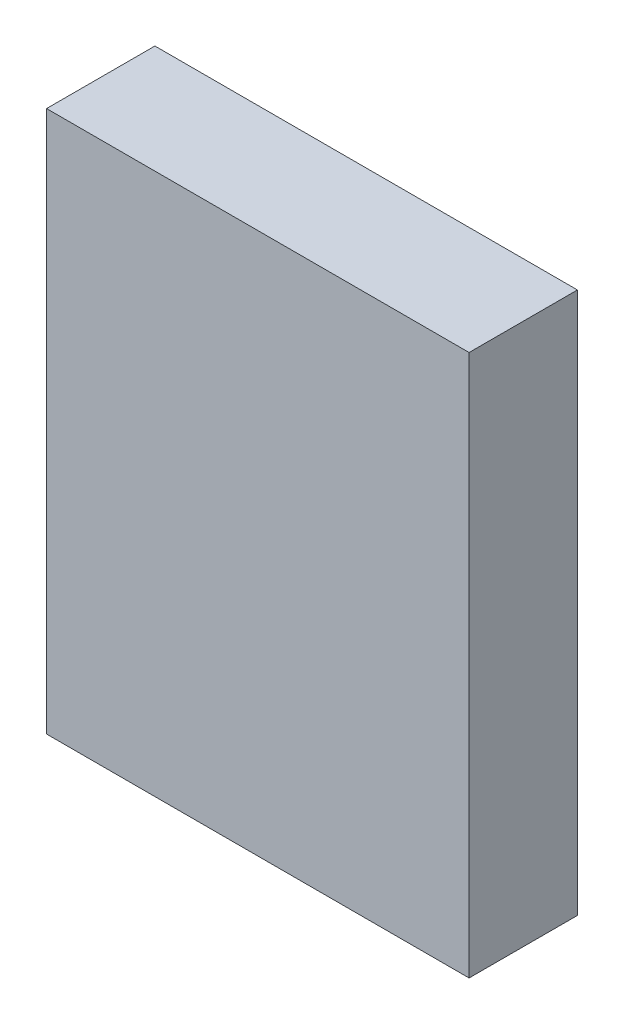
ISO-10303-21;
HEADER;
FILE_DESCRIPTION(('STEP AP214'),'2;1');
FILE_NAME('part.step','',(''),(''),'','','');
FILE_SCHEMA(('AUTOMOTIVE_DESIGN { 1 0 10303 214 1 1 1 1 }'));
ENDSEC;
DATA;
#1=APPLICATION_CONTEXT('core data for automotive mechanical design processes');
#2=APPLICATION_PROTOCOL_DEFINITION('international standard','automotive_design',2000,#1);
#3=PRODUCT_CONTEXT('',#1,'mechanical');
#4=PRODUCT('Part','Part','',(#3));
#5=PRODUCT_RELATED_PRODUCT_CATEGORY('part','',(#4));
#6=PRODUCT_DEFINITION_FORMATION('','',#4);
#7=PRODUCT_DEFINITION_CONTEXT('part definition',#1,'design');
#8=PRODUCT_DEFINITION('design','',#6,#7);
#9=PRODUCT_DEFINITION_SHAPE('','',#8);
#10=(LENGTH_UNIT() NAMED_UNIT(*) SI_UNIT(.MILLI.,.METRE.));
#11=(NAMED_UNIT(*) PLANE_ANGLE_UNIT() SI_UNIT($,.RADIAN.));
#12=(NAMED_UNIT(*) SI_UNIT($,.STERADIAN.) SOLID_ANGLE_UNIT());
#13=UNCERTAINTY_MEASURE_WITH_UNIT(LENGTH_MEASURE(1.E-05),#10,'distance_accuracy_value','');
#14=(GEOMETRIC_REPRESENTATION_CONTEXT(3) GLOBAL_UNCERTAINTY_ASSIGNED_CONTEXT((#13)) GLOBAL_UNIT_ASSIGNED_CONTEXT((#10,
#11,#12)) REPRESENTATION_CONTEXT('',''));
#15=CARTESIAN_POINT('',(0.,0.,0.));
#16=DIRECTION('',(0.,0.,1.));
#17=DIRECTION('',(1.,0.,0.));
#18=AXIS2_PLACEMENT_3D('',#15,#16,#17);
#19=CARTESIAN_POINT('',(1.95,2.5,1.));
#20=DIRECTION('',(-1.,0.,0.));
#21=DIRECTION('',(0.,-1.,0.));
#22=AXIS2_PLACEMENT_3D('',#19,#20,#21);
#23=PLANE('',#22);
#24=DIRECTION('',(0.,1.,0.));
#25=VECTOR('',#24,1.);
#26=CARTESIAN_POINT('',(1.95,2.5,0.));
#27=LINE('',#26,#25);
#28=CARTESIAN_POINT('',(1.95,-2.5,0.));
#29=VERTEX_POINT('',#28);
#30=CARTESIAN_POINT('',(1.95,2.5,0.));
#31=VERTEX_POINT('',#30);
#32=EDGE_CURVE('E95',#29,#31,#27,.T.);
#33=ORIENTED_EDGE('',*,*,#32,.T.);
#34=DIRECTION('',(0.,0.,-1.));
#35=VECTOR('',#34,1.);
#36=CARTESIAN_POINT('',(1.95,2.5,1.));
#37=LINE('',#36,#35);
#38=CARTESIAN_POINT('',(1.95,2.5,1.));
#39=VERTEX_POINT('',#38);
#40=EDGE_CURVE('E11',#39,#31,#37,.T.);
#41=ORIENTED_EDGE('',*,*,#40,.F.);
#42=DIRECTION('',(0.,1.,0.));
#43=VECTOR('',#42,1.);
#44=CARTESIAN_POINT('',(1.95,2.5,1.));
#45=LINE('',#44,#43);
#46=CARTESIAN_POINT('',(1.95,-2.5,1.));
#47=VERTEX_POINT('',#46);
#48=EDGE_CURVE('E83',#47,#39,#45,.T.);
#49=ORIENTED_EDGE('',*,*,#48,.F.);
#50=DIRECTION('',(0.,0.,-1.));
#51=VECTOR('',#50,1.);
#52=CARTESIAN_POINT('',(1.95,-2.5,1.));
#53=LINE('',#52,#51);
#54=EDGE_CURVE('E91',#47,#29,#53,.T.);
#55=ORIENTED_EDGE('',*,*,#54,.T.);
#56=EDGE_LOOP('',(#33,#41,#49,#55));
#57=FACE_BOUND('',#56,.T.);
#58=ADVANCED_FACE('F32',(#57),#23,.F.);
#59=CARTESIAN_POINT('',(-1.95,2.5,1.));
#60=DIRECTION('',(0.,-1.,0.));
#61=DIRECTION('',(0.,0.,-1.));
#62=AXIS2_PLACEMENT_3D('',#59,#60,#61);
#63=PLANE('',#62);
#64=DIRECTION('',(-1.,0.,0.));
#65=VECTOR('',#64,1.);
#66=CARTESIAN_POINT('',(-1.95,2.5,0.));
#67=LINE('',#66,#65);
#68=CARTESIAN_POINT('',(-1.95,2.5,0.));
#69=VERTEX_POINT('',#68);
#70=EDGE_CURVE('E87',#31,#69,#67,.T.);
#71=ORIENTED_EDGE('',*,*,#70,.T.);
#72=DIRECTION('',(0.,0.,-1.));
#73=VECTOR('',#72,1.);
#74=CARTESIAN_POINT('',(-1.95,2.5,1.));
#75=LINE('',#74,#73);
#76=CARTESIAN_POINT('',(-1.95,2.5,1.));
#77=VERTEX_POINT('',#76);
#78=EDGE_CURVE('E40',#77,#69,#75,.T.);
#79=ORIENTED_EDGE('',*,*,#78,.F.);
#80=DIRECTION('',(-1.,0.,0.));
#81=VECTOR('',#80,1.);
#82=CARTESIAN_POINT('',(-1.95,2.5,1.));
#83=LINE('',#82,#81);
#84=EDGE_CURVE('E78',#39,#77,#83,.T.);
#85=ORIENTED_EDGE('',*,*,#84,.F.);
#86=ORIENTED_EDGE('',*,*,#40,.T.);
#87=EDGE_LOOP('',(#71,#79,#85,#86));
#88=FACE_BOUND('',#87,.T.);
#89=ADVANCED_FACE('F86',(#88),#63,.F.);
#90=CARTESIAN_POINT('',(-1.95,2.5,1.));
#91=DIRECTION('',(1.,0.,0.));
#92=DIRECTION('',(0.,1.,0.));
#93=AXIS2_PLACEMENT_3D('',#90,#91,#92);
#94=PLANE('',#93);
#95=DIRECTION('',(0.,-1.,0.));
#96=VECTOR('',#95,1.);
#97=CARTESIAN_POINT('',(-1.95,2.5,0.));
#98=LINE('',#97,#96);
#99=CARTESIAN_POINT('',(-1.95,-2.5,0.));
#100=VERTEX_POINT('',#99);
#101=EDGE_CURVE('E65',#69,#100,#98,.T.);
#102=ORIENTED_EDGE('',*,*,#101,.T.);
#103=DIRECTION('',(0.,0.,-1.));
#104=VECTOR('',#103,1.);
#105=CARTESIAN_POINT('',(-1.95,-2.5,1.));
#106=LINE('',#105,#104);
#107=CARTESIAN_POINT('',(-1.95,-2.5,1.));
#108=VERTEX_POINT('',#107);
#109=EDGE_CURVE('E88',#108,#100,#106,.T.);
#110=ORIENTED_EDGE('',*,*,#109,.F.);
#111=DIRECTION('',(0.,-1.,0.));
#112=VECTOR('',#111,1.);
#113=CARTESIAN_POINT('',(-1.95,2.5,1.));
#114=LINE('',#113,#112);
#115=EDGE_CURVE('E81',#77,#108,#114,.T.);
#116=ORIENTED_EDGE('',*,*,#115,.F.);
#117=ORIENTED_EDGE('',*,*,#78,.T.);
#118=EDGE_LOOP('',(#102,#110,#116,#117));
#119=FACE_BOUND('',#118,.T.);
#120=ADVANCED_FACE('F89',(#119),#94,.F.);
#121=CARTESIAN_POINT('',(-1.95,-2.5,1.));
#122=DIRECTION('',(0.,1.,0.));
#123=DIRECTION('',(0.,0.,1.));
#124=AXIS2_PLACEMENT_3D('',#121,#122,#123);
#125=PLANE('',#124);
#126=DIRECTION('',(1.,0.,0.));
#127=VECTOR('',#126,1.);
#128=CARTESIAN_POINT('',(-1.95,-2.5,0.));
#129=LINE('',#128,#127);
#130=EDGE_CURVE('E71',#100,#29,#129,.T.);
#131=ORIENTED_EDGE('',*,*,#130,.T.);
#132=ORIENTED_EDGE('',*,*,#54,.F.);
#133=DIRECTION('',(1.,0.,0.));
#134=VECTOR('',#133,1.);
#135=CARTESIAN_POINT('',(-1.95,-2.5,1.));
#136=LINE('',#135,#134);
#137=EDGE_CURVE('E48',#108,#47,#136,.T.);
#138=ORIENTED_EDGE('',*,*,#137,.F.);
#139=ORIENTED_EDGE('',*,*,#109,.T.);
#140=EDGE_LOOP('',(#131,#132,#138,#139));
#141=FACE_BOUND('',#140,.T.);
#142=ADVANCED_FACE('F102',(#141),#125,.F.);
#143=CARTESIAN_POINT('',(0.,0.,1.));
#144=DIRECTION('',(0.,0.,1.));
#145=DIRECTION('',(1.,0.,0.));
#146=AXIS2_PLACEMENT_3D('',#143,#144,#145);
#147=PLANE('',#146);
#148=ORIENTED_EDGE('',*,*,#48,.T.);
#149=ORIENTED_EDGE('',*,*,#84,.T.);
#150=ORIENTED_EDGE('',*,*,#115,.T.);
#151=ORIENTED_EDGE('',*,*,#137,.T.);
#152=EDGE_LOOP('',(#148,#149,#150,#151));
#153=FACE_BOUND('',#152,.T.);
#154=ADVANCED_FACE('F79',(#153),#147,.T.);
#155=CARTESIAN_POINT('',(0.,0.,0.));
#156=DIRECTION('',(0.,0.,1.));
#157=DIRECTION('',(1.,0.,0.));
#158=AXIS2_PLACEMENT_3D('',#155,#156,#157);
#159=PLANE('',#158);
#160=ORIENTED_EDGE('',*,*,#32,.F.);
#161=ORIENTED_EDGE('',*,*,#130,.F.);
#162=ORIENTED_EDGE('',*,*,#101,.F.);
#163=ORIENTED_EDGE('',*,*,#70,.F.);
#164=EDGE_LOOP('',(#160,#161,#162,#163));
#165=FACE_BOUND('',#164,.T.);
#166=ADVANCED_FACE('F105',(#165),#159,.F.);
#167=CLOSED_SHELL('',(#58,#89,#120,#142,#154,#166));
#168=MANIFOLD_SOLID_BREP('B2',#167);
#169=ADVANCED_BREP_SHAPE_REPRESENTATION('',(#18,#168),#14);
#170=SHAPE_DEFINITION_REPRESENTATION(#9,#169);
ENDSEC;
END-ISO-10303-21;
